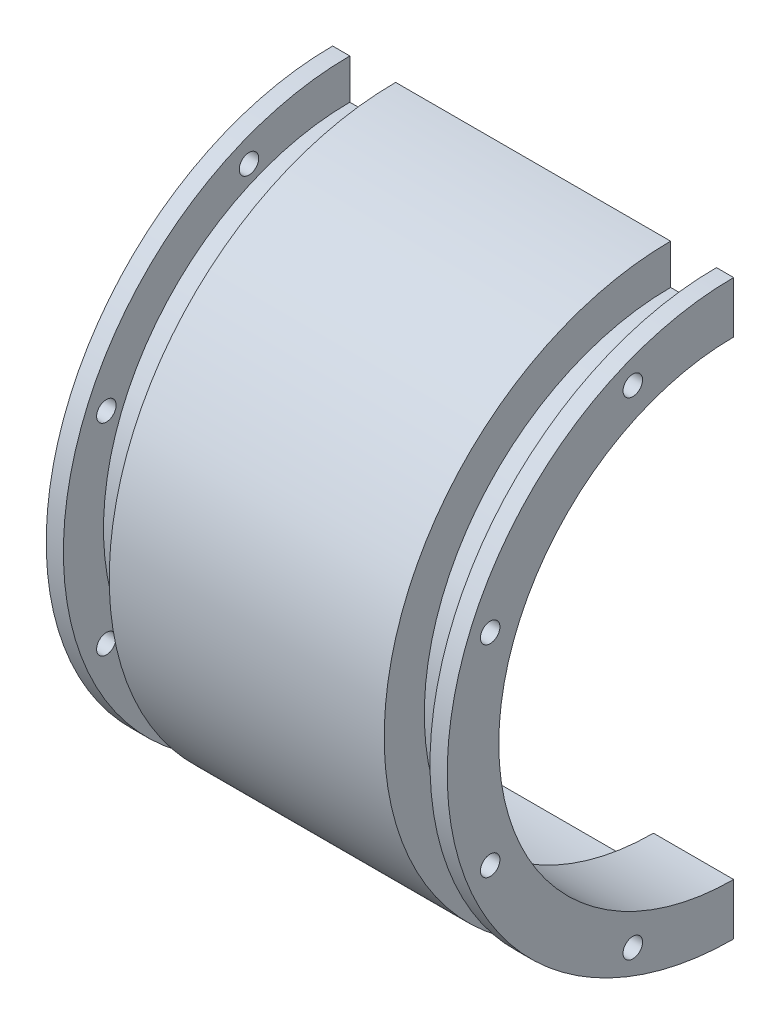
ISO-10303-21;
HEADER;
FILE_DESCRIPTION(('STEP AP214'),'2;1');
FILE_NAME('part.step','',(''),(''),'','','');
FILE_SCHEMA(('AUTOMOTIVE_DESIGN { 1 0 10303 214 1 1 1 1 }'));
ENDSEC;
DATA;
#1=APPLICATION_CONTEXT('core data for automotive mechanical design processes');
#2=APPLICATION_PROTOCOL_DEFINITION('international standard','automotive_design',2000,#1);
#3=PRODUCT_CONTEXT('',#1,'mechanical');
#4=PRODUCT('Part','Part','',(#3));
#5=PRODUCT_RELATED_PRODUCT_CATEGORY('part','',(#4));
#6=PRODUCT_DEFINITION_FORMATION('','',#4);
#7=PRODUCT_DEFINITION_CONTEXT('part definition',#1,'design');
#8=PRODUCT_DEFINITION('design','',#6,#7);
#9=PRODUCT_DEFINITION_SHAPE('','',#8);
#10=(LENGTH_UNIT() NAMED_UNIT(*) SI_UNIT(.MILLI.,.METRE.));
#11=(NAMED_UNIT(*) PLANE_ANGLE_UNIT() SI_UNIT($,.RADIAN.));
#12=(NAMED_UNIT(*) SI_UNIT($,.STERADIAN.) SOLID_ANGLE_UNIT());
#13=UNCERTAINTY_MEASURE_WITH_UNIT(LENGTH_MEASURE(1.E-05),#10,'distance_accuracy_value','');
#14=(GEOMETRIC_REPRESENTATION_CONTEXT(3) GLOBAL_UNCERTAINTY_ASSIGNED_CONTEXT((#13)) GLOBAL_UNIT_ASSIGNED_CONTEXT((#10,
#11,#12)) REPRESENTATION_CONTEXT('',''));
#15=CARTESIAN_POINT('',(0.,0.,0.));
#16=DIRECTION('',(0.,0.,1.));
#17=DIRECTION('',(1.,0.,0.));
#18=AXIS2_PLACEMENT_3D('',#15,#16,#17);
#19=CARTESIAN_POINT('',(35.,-41.,-2.86301469785137E-13));
#20=DIRECTION('',(-1.,0.,0.));
#21=DIRECTION('',(0.,-1.,0.));
#22=AXIS2_PLACEMENT_3D('',#19,#20,#21);
#23=PLANE('',#22);
#24=CARTESIAN_POINT('',(35.,42.4984584955192,17.6034378887942));
#25=DIRECTION('',(1.,0.,0.));
#26=DIRECTION('',(0.,0.,-1.));
#27=AXIS2_PLACEMENT_3D('',#24,#25,#26);
#28=CIRCLE('',#27,1.69999999999999);
#29=CARTESIAN_POINT('',(35.,42.4984584955192,15.9034378887942));
#30=VERTEX_POINT('',#29);
#31=EDGE_CURVE('E678',#30,#30,#28,.T.);
#32=ORIENTED_EDGE('',*,*,#31,.F.);
#33=EDGE_LOOP('',(#32));
#34=FACE_BOUND('',#33,.T.);
#35=CARTESIAN_POINT('',(35.,17.603437888794,42.4984584955192));
#36=DIRECTION('',(1.,0.,0.));
#37=DIRECTION('',(0.,0.,-1.));
#38=AXIS2_PLACEMENT_3D('',#35,#36,#37);
#39=CIRCLE('',#38,1.69999999999999);
#40=CARTESIAN_POINT('',(35.,17.603437888794,40.7984584955192));
#41=VERTEX_POINT('',#40);
#42=EDGE_CURVE('E674',#41,#41,#39,.T.);
#43=ORIENTED_EDGE('',*,*,#42,.F.);
#44=EDGE_LOOP('',(#43));
#45=FACE_BOUND('',#44,.T.);
#46=CARTESIAN_POINT('',(35.,-17.6034378887943,42.4984584955191));
#47=DIRECTION('',(1.,0.,0.));
#48=DIRECTION('',(0.,0.,-1.));
#49=AXIS2_PLACEMENT_3D('',#46,#47,#48);
#50=CIRCLE('',#49,1.69999999999999);
#51=CARTESIAN_POINT('',(35.,-17.6034378887943,40.7984584955191));
#52=VERTEX_POINT('',#51);
#53=EDGE_CURVE('E670',#52,#52,#50,.T.);
#54=ORIENTED_EDGE('',*,*,#53,.F.);
#55=EDGE_LOOP('',(#54));
#56=FACE_BOUND('',#55,.T.);
#57=CARTESIAN_POINT('',(35.,0.,0.));
#58=DIRECTION('',(-1.,0.,0.));
#59=DIRECTION('',(0.,-1.,0.));
#60=AXIS2_PLACEMENT_3D('',#57,#58,#59);
#61=CIRCLE('',#60,50.);
#62=CARTESIAN_POINT('',(35.,-50.,-3.49148133884313E-13));
#63=VERTEX_POINT('',#62);
#64=CARTESIAN_POINT('',(35.,50.,0.));
#65=VERTEX_POINT('',#64);
#66=EDGE_CURVE('E291',#63,#65,#61,.T.);
#67=ORIENTED_EDGE('',*,*,#66,.F.);
#68=DIRECTION('',(0.,-1.,0.));
#69=VECTOR('',#68,1.);
#70=CARTESIAN_POINT('',(35.,-41.,-2.86301469785137E-13));
#71=LINE('',#70,#69);
#72=CARTESIAN_POINT('',(35.,-41.,-2.86301469785137E-13));
#73=VERTEX_POINT('',#72);
#74=EDGE_CURVE('E244',#73,#63,#71,.T.);
#75=ORIENTED_EDGE('',*,*,#74,.F.);
#76=CARTESIAN_POINT('',(35.,0.,0.));
#77=DIRECTION('',(-1.,0.,0.));
#78=DIRECTION('',(0.,-1.,0.));
#79=AXIS2_PLACEMENT_3D('',#76,#77,#78);
#80=CIRCLE('',#79,41.);
#81=CARTESIAN_POINT('',(35.,41.,0.));
#82=VERTEX_POINT('',#81);
#83=EDGE_CURVE('E293',#73,#82,#80,.T.);
#84=ORIENTED_EDGE('',*,*,#83,.T.);
#85=DIRECTION('',(0.,1.,0.));
#86=VECTOR('',#85,1.);
#87=CARTESIAN_POINT('',(35.,41.,0.));
#88=LINE('',#87,#86);
#89=EDGE_CURVE('E202',#82,#65,#88,.T.);
#90=ORIENTED_EDGE('',*,*,#89,.T.);
#91=EDGE_LOOP('',(#67,#75,#84,#90));
#92=FACE_BOUND('',#91,.T.);
#93=CARTESIAN_POINT('',(35.,-42.4984584955193,17.6034378887939));
#94=DIRECTION('',(1.,0.,0.));
#95=DIRECTION('',(0.,0.,-1.));
#96=AXIS2_PLACEMENT_3D('',#93,#94,#95);
#97=CIRCLE('',#96,1.69999999999999);
#98=CARTESIAN_POINT('',(35.,-42.4984584955193,15.9034378887939));
#99=VERTEX_POINT('',#98);
#100=EDGE_CURVE('E626',#99,#99,#97,.T.);
#101=ORIENTED_EDGE('',*,*,#100,.F.);
#102=EDGE_LOOP('',(#101));
#103=FACE_BOUND('',#102,.T.);
#104=ADVANCED_FACE('F39',(#34,#45,#56,#92,#103),#23,.F.);
#105=CARTESIAN_POINT('',(-35.,-50.,-3.49148133884313E-13));
#106=DIRECTION('',(1.,0.,0.));
#107=DIRECTION('',(0.,1.,0.));
#108=AXIS2_PLACEMENT_3D('',#105,#106,#107);
#109=PLANE('',#108);
#110=CARTESIAN_POINT('',(-35.,42.4984584955192,17.6034378887942));
#111=DIRECTION('',(-1.,0.,0.));
#112=DIRECTION('',(0.,0.,1.));
#113=AXIS2_PLACEMENT_3D('',#110,#111,#112);
#114=CIRCLE('',#113,1.69999999999999);
#115=CARTESIAN_POINT('',(-35.,42.4984584955192,19.3034378887942));
#116=VERTEX_POINT('',#115);
#117=EDGE_CURVE('E625',#116,#116,#114,.T.);
#118=ORIENTED_EDGE('',*,*,#117,.F.);
#119=EDGE_LOOP('',(#118));
#120=FACE_BOUND('',#119,.T.);
#121=CARTESIAN_POINT('',(-35.,17.603437888794,42.4984584955192));
#122=DIRECTION('',(-1.,0.,0.));
#123=DIRECTION('',(0.,0.,1.));
#124=AXIS2_PLACEMENT_3D('',#121,#122,#123);
#125=CIRCLE('',#124,1.69999999999999);
#126=CARTESIAN_POINT('',(-35.,17.603437888794,44.1984584955192));
#127=VERTEX_POINT('',#126);
#128=EDGE_CURVE('E637',#127,#127,#125,.T.);
#129=ORIENTED_EDGE('',*,*,#128,.F.);
#130=EDGE_LOOP('',(#129));
#131=FACE_BOUND('',#130,.T.);
#132=CARTESIAN_POINT('',(-35.,-42.4984584955193,17.6034378887939));
#133=DIRECTION('',(-1.,0.,0.));
#134=DIRECTION('',(0.,0.,1.));
#135=AXIS2_PLACEMENT_3D('',#132,#133,#134);
#136=CIRCLE('',#135,1.69999999999999);
#137=CARTESIAN_POINT('',(-35.,-42.4984584955193,19.3034378887939));
#138=VERTEX_POINT('',#137);
#139=EDGE_CURVE('E649',#138,#138,#136,.T.);
#140=ORIENTED_EDGE('',*,*,#139,.F.);
#141=EDGE_LOOP('',(#140));
#142=FACE_BOUND('',#141,.T.);
#143=CARTESIAN_POINT('',(-35.,0.,0.));
#144=DIRECTION('',(-1.,0.,0.));
#145=DIRECTION('',(0.,-1.,0.));
#146=AXIS2_PLACEMENT_3D('',#143,#144,#145);
#147=CIRCLE('',#146,41.);
#148=CARTESIAN_POINT('',(-35.,-41.,-2.86301469785137E-13));
#149=VERTEX_POINT('',#148);
#150=CARTESIAN_POINT('',(-35.,41.,0.));
#151=VERTEX_POINT('',#150);
#152=EDGE_CURVE('E163',#149,#151,#147,.T.);
#153=ORIENTED_EDGE('',*,*,#152,.F.);
#154=DIRECTION('',(0.,1.,0.));
#155=VECTOR('',#154,1.);
#156=CARTESIAN_POINT('',(-35.,-50.,-3.49148133884313E-13));
#157=LINE('',#156,#155);
#158=CARTESIAN_POINT('',(-35.,-50.,-3.49148133884313E-13));
#159=VERTEX_POINT('',#158);
#160=EDGE_CURVE('E231',#159,#149,#157,.T.);
#161=ORIENTED_EDGE('',*,*,#160,.F.);
#162=CARTESIAN_POINT('',(-35.,0.,0.));
#163=DIRECTION('',(-1.,0.,0.));
#164=DIRECTION('',(0.,-1.,0.));
#165=AXIS2_PLACEMENT_3D('',#162,#163,#164);
#166=CIRCLE('',#165,50.);
#167=CARTESIAN_POINT('',(-35.,50.,0.));
#168=VERTEX_POINT('',#167);
#169=EDGE_CURVE('E181',#159,#168,#166,.T.);
#170=ORIENTED_EDGE('',*,*,#169,.T.);
#171=DIRECTION('',(0.,-1.,0.));
#172=VECTOR('',#171,1.);
#173=CARTESIAN_POINT('',(-35.,50.,0.));
#174=LINE('',#173,#172);
#175=EDGE_CURVE('E178',#168,#151,#174,.T.);
#176=ORIENTED_EDGE('',*,*,#175,.T.);
#177=EDGE_LOOP('',(#153,#161,#170,#176));
#178=FACE_BOUND('',#177,.T.);
#179=CARTESIAN_POINT('',(-35.,-17.6034378887943,42.4984584955191));
#180=DIRECTION('',(-1.,0.,0.));
#181=DIRECTION('',(0.,0.,1.));
#182=AXIS2_PLACEMENT_3D('',#179,#180,#181);
#183=CIRCLE('',#182,1.69999999999999);
#184=CARTESIAN_POINT('',(-35.,-17.6034378887943,44.1984584955191));
#185=VERTEX_POINT('',#184);
#186=EDGE_CURVE('E643',#185,#185,#183,.T.);
#187=ORIENTED_EDGE('',*,*,#186,.F.);
#188=EDGE_LOOP('',(#187));
#189=FACE_BOUND('',#188,.T.);
#190=ADVANCED_FACE('F179',(#120,#131,#142,#178,#189),#109,.F.);
#191=CARTESIAN_POINT('',(-50.,0.,0.));
#192=DIRECTION('',(-1.,0.,0.));
#193=DIRECTION('',(0.,-1.,0.));
#194=AXIS2_PLACEMENT_3D('',#191,#192,#193);
#195=CYLINDRICAL_SURFACE('',#194,41.);
#196=CARTESIAN_POINT('',(-21.,0.,0.));
#197=DIRECTION('',(-1.,0.,0.));
#198=DIRECTION('',(0.,-1.,0.));
#199=AXIS2_PLACEMENT_3D('',#196,#197,#198);
#200=CIRCLE('',#199,41.);
#201=CARTESIAN_POINT('',(-21.,-41.,-2.86301469785137E-13));
#202=VERTEX_POINT('',#201);
#203=CARTESIAN_POINT('',(-21.,41.,0.));
#204=VERTEX_POINT('',#203);
#205=EDGE_CURVE('E175',#202,#204,#200,.T.);
#206=ORIENTED_EDGE('',*,*,#205,.F.);
#207=DIRECTION('',(1.,0.,0.));
#208=VECTOR('',#207,1.);
#209=CARTESIAN_POINT('',(-35.,-41.,-2.86301469785137E-13));
#210=LINE('',#209,#208);
#211=EDGE_CURVE('E170',#149,#202,#210,.T.);
#212=ORIENTED_EDGE('',*,*,#211,.F.);
#213=ORIENTED_EDGE('',*,*,#152,.T.);
#214=DIRECTION('',(1.,0.,0.));
#215=VECTOR('',#214,1.);
#216=CARTESIAN_POINT('',(-35.,41.,0.));
#217=LINE('',#216,#215);
#218=EDGE_CURVE('E167',#151,#204,#217,.T.);
#219=ORIENTED_EDGE('',*,*,#218,.T.);
#220=EDGE_LOOP('',(#206,#212,#213,#219));
#221=FACE_BOUND('',#220,.T.);
#222=ADVANCED_FACE('F165',(#221),#195,.F.);
#223=CARTESIAN_POINT('',(-21.,-41.,-2.86301469785137E-13));
#224=DIRECTION('',(-1.,0.,0.));
#225=DIRECTION('',(0.,-1.,0.));
#226=AXIS2_PLACEMENT_3D('',#223,#224,#225);
#227=PLANE('',#226);
#228=DIRECTION('',(0.,1.,0.));
#229=VECTOR('',#228,1.);
#230=CARTESIAN_POINT('',(-21.,41.,0.));
#231=LINE('',#230,#229);
#232=CARTESIAN_POINT('',(-21.,42.,0.));
#233=VERTEX_POINT('',#232);
#234=EDGE_CURVE('E189',#204,#233,#231,.T.);
#235=ORIENTED_EDGE('',*,*,#234,.T.);
#236=CARTESIAN_POINT('',(-21.,0.,0.));
#237=DIRECTION('',(-1.,0.,0.));
#238=DIRECTION('',(0.,-1.,0.));
#239=AXIS2_PLACEMENT_3D('',#236,#237,#238);
#240=CIRCLE('',#239,42.);
#241=CARTESIAN_POINT('',(-21.,-42.,-2.93284432462823E-13));
#242=VERTEX_POINT('',#241);
#243=EDGE_CURVE('E303',#233,#242,#240,.F.);
#244=ORIENTED_EDGE('',*,*,#243,.T.);
#245=DIRECTION('',(0.,-1.,0.));
#246=VECTOR('',#245,1.);
#247=CARTESIAN_POINT('',(-21.,-41.,-2.86301469785137E-13));
#248=LINE('',#247,#246);
#249=EDGE_CURVE('E234',#202,#242,#248,.T.);
#250=ORIENTED_EDGE('',*,*,#249,.F.);
#251=ORIENTED_EDGE('',*,*,#205,.T.);
#252=EDGE_LOOP('',(#235,#244,#250,#251));
#253=FACE_BOUND('',#252,.T.);
#254=ADVANCED_FACE('F365',(#253),#227,.F.);
#255=CARTESIAN_POINT('',(-50.,0.,0.));
#256=DIRECTION('',(-1.,0.,0.));
#257=DIRECTION('',(0.,-1.,0.));
#258=AXIS2_PLACEMENT_3D('',#255,#256,#257);
#259=CYLINDRICAL_SURFACE('',#258,47.);
#260=DIRECTION('',(1.,0.,0.));
#261=VECTOR('',#260,1.);
#262=CARTESIAN_POINT('',(-21.,-47.,-3.28199245851255E-13));
#263=LINE('',#262,#261);
#264=CARTESIAN_POINT('',(-16.,-47.,-3.28199245851255E-13));
#265=VERTEX_POINT('',#264);
#266=CARTESIAN_POINT('',(16.,-47.,-3.28199245851254E-13));
#267=VERTEX_POINT('',#266);
#268=EDGE_CURVE('E237',#265,#267,#263,.T.);
#269=ORIENTED_EDGE('',*,*,#268,.F.);
#270=CARTESIAN_POINT('',(-16.,0.,0.));
#271=DIRECTION('',(-1.,0.,0.));
#272=DIRECTION('',(0.,-1.,0.));
#273=AXIS2_PLACEMENT_3D('',#270,#271,#272);
#274=CIRCLE('',#273,47.);
#275=CARTESIAN_POINT('',(-16.,47.,0.));
#276=VERTEX_POINT('',#275);
#277=EDGE_CURVE('E300',#265,#276,#274,.T.);
#278=ORIENTED_EDGE('',*,*,#277,.T.);
#279=DIRECTION('',(1.,0.,0.));
#280=VECTOR('',#279,1.);
#281=CARTESIAN_POINT('',(-21.,47.,0.));
#282=LINE('',#281,#280);
#283=CARTESIAN_POINT('',(16.,47.,0.));
#284=VERTEX_POINT('',#283);
#285=EDGE_CURVE('E191',#276,#284,#282,.T.);
#286=ORIENTED_EDGE('',*,*,#285,.T.);
#287=CARTESIAN_POINT('',(16.,0.,0.));
#288=DIRECTION('',(1.,0.,0.));
#289=DIRECTION('',(0.,1.,0.));
#290=AXIS2_PLACEMENT_3D('',#287,#288,#289);
#291=CIRCLE('',#290,47.);
#292=EDGE_CURVE('E174',#284,#267,#291,.T.);
#293=ORIENTED_EDGE('',*,*,#292,.T.);
#294=EDGE_LOOP('',(#269,#278,#286,#293));
#295=FACE_BOUND('',#294,.T.);
#296=ADVANCED_FACE('F315',(#295),#259,.F.);
#297=CARTESIAN_POINT('',(21.,-47.,-3.28199245851254E-13));
#298=DIRECTION('',(1.,0.,0.));
#299=DIRECTION('',(0.,1.,0.));
#300=AXIS2_PLACEMENT_3D('',#297,#298,#299);
#301=PLANE('',#300);
#302=DIRECTION('',(0.,1.,0.));
#303=VECTOR('',#302,1.);
#304=CARTESIAN_POINT('',(21.,-47.,-3.28199245851254E-13));
#305=LINE('',#304,#303);
#306=CARTESIAN_POINT('',(21.,-42.,-2.93284432462823E-13));
#307=VERTEX_POINT('',#306);
#308=CARTESIAN_POINT('',(21.,-41.,-2.86301469785137E-13));
#309=VERTEX_POINT('',#308);
#310=EDGE_CURVE('E239',#307,#309,#305,.T.);
#311=ORIENTED_EDGE('',*,*,#310,.F.);
#312=CARTESIAN_POINT('',(21.,0.,0.));
#313=DIRECTION('',(1.,0.,0.));
#314=DIRECTION('',(0.,1.,0.));
#315=AXIS2_PLACEMENT_3D('',#312,#313,#314);
#316=CIRCLE('',#315,42.);
#317=CARTESIAN_POINT('',(21.,42.,0.));
#318=VERTEX_POINT('',#317);
#319=EDGE_CURVE('E305',#307,#318,#316,.F.);
#320=ORIENTED_EDGE('',*,*,#319,.T.);
#321=DIRECTION('',(0.,-1.,0.));
#322=VECTOR('',#321,1.);
#323=CARTESIAN_POINT('',(21.,47.,0.));
#324=LINE('',#323,#322);
#325=CARTESIAN_POINT('',(21.,41.,0.));
#326=VERTEX_POINT('',#325);
#327=EDGE_CURVE('E197',#318,#326,#324,.T.);
#328=ORIENTED_EDGE('',*,*,#327,.T.);
#329=CARTESIAN_POINT('',(21.,0.,0.));
#330=DIRECTION('',(-1.,0.,0.));
#331=DIRECTION('',(0.,-1.,0.));
#332=AXIS2_PLACEMENT_3D('',#329,#330,#331);
#333=CIRCLE('',#332,41.);
#334=EDGE_CURVE('E295',#309,#326,#333,.T.);
#335=ORIENTED_EDGE('',*,*,#334,.F.);
#336=EDGE_LOOP('',(#311,#320,#328,#335));
#337=FACE_BOUND('',#336,.T.);
#338=ADVANCED_FACE('F318',(#337),#301,.F.);
#339=CARTESIAN_POINT('',(-50.,0.,0.));
#340=DIRECTION('',(-1.,0.,0.));
#341=DIRECTION('',(0.,-1.,0.));
#342=AXIS2_PLACEMENT_3D('',#339,#340,#341);
#343=CYLINDRICAL_SURFACE('',#342,41.);
#344=ORIENTED_EDGE('',*,*,#83,.F.);
#345=DIRECTION('',(1.,0.,0.));
#346=VECTOR('',#345,1.);
#347=CARTESIAN_POINT('',(21.,-41.,-2.86301469785137E-13));
#348=LINE('',#347,#346);
#349=EDGE_CURVE('E241',#309,#73,#348,.T.);
#350=ORIENTED_EDGE('',*,*,#349,.F.);
#351=ORIENTED_EDGE('',*,*,#334,.T.);
#352=DIRECTION('',(1.,0.,0.));
#353=VECTOR('',#352,1.);
#354=CARTESIAN_POINT('',(21.,41.,0.));
#355=LINE('',#354,#353);
#356=EDGE_CURVE('E199',#326,#82,#355,.T.);
#357=ORIENTED_EDGE('',*,*,#356,.T.);
#358=EDGE_LOOP('',(#344,#350,#351,#357));
#359=FACE_BOUND('',#358,.T.);
#360=ADVANCED_FACE('F395',(#359),#343,.F.);
#361=CARTESIAN_POINT('',(-50.,0.,0.));
#362=DIRECTION('',(-1.,0.,0.));
#363=DIRECTION('',(0.,-1.,0.));
#364=AXIS2_PLACEMENT_3D('',#361,#362,#363);
#365=CYLINDRICAL_SURFACE('',#364,50.);
#366=CARTESIAN_POINT('',(32.,0.,0.));
#367=DIRECTION('',(-1.,0.,0.));
#368=DIRECTION('',(0.,-1.,0.));
#369=AXIS2_PLACEMENT_3D('',#366,#367,#368);
#370=CIRCLE('',#369,50.);
#371=CARTESIAN_POINT('',(32.,-50.,-3.49148133884313E-13));
#372=VERTEX_POINT('',#371);
#373=CARTESIAN_POINT('',(32.,50.,0.));
#374=VERTEX_POINT('',#373);
#375=EDGE_CURVE('E289',#372,#374,#370,.T.);
#376=ORIENTED_EDGE('',*,*,#375,.F.);
#377=DIRECTION('',(-1.,0.,0.));
#378=VECTOR('',#377,1.);
#379=CARTESIAN_POINT('',(35.,-50.,-3.49148133884313E-13));
#380=LINE('',#379,#378);
#381=EDGE_CURVE('E247',#63,#372,#380,.T.);
#382=ORIENTED_EDGE('',*,*,#381,.F.);
#383=ORIENTED_EDGE('',*,*,#66,.T.);
#384=DIRECTION('',(-1.,0.,0.));
#385=VECTOR('',#384,1.);
#386=CARTESIAN_POINT('',(35.,50.,0.));
#387=LINE('',#386,#385);
#388=EDGE_CURVE('E205',#65,#374,#387,.T.);
#389=ORIENTED_EDGE('',*,*,#388,.T.);
#390=EDGE_LOOP('',(#376,#382,#383,#389));
#391=FACE_BOUND('',#390,.T.);
#392=ADVANCED_FACE('F330',(#391),#365,.T.);
#393=CARTESIAN_POINT('',(32.,-50.,-3.49148133884313E-13));
#394=DIRECTION('',(1.,0.,0.));
#395=DIRECTION('',(0.,1.,0.));
#396=AXIS2_PLACEMENT_3D('',#393,#394,#395);
#397=PLANE('',#396);
#398=CARTESIAN_POINT('',(32.,42.4984584955192,17.6034378887942));
#399=DIRECTION('',(1.,0.,0.));
#400=DIRECTION('',(0.,1.,0.));
#401=AXIS2_PLACEMENT_3D('',#398,#399,#400);
#402=CIRCLE('',#401,1.69999999999999);
#403=CARTESIAN_POINT('',(32.,44.1984584955192,17.6034378887942));
#404=VERTEX_POINT('',#403);
#405=EDGE_CURVE('E613',#404,#404,#402,.T.);
#406=ORIENTED_EDGE('',*,*,#405,.T.);
#407=EDGE_LOOP('',(#406));
#408=FACE_BOUND('',#407,.T.);
#409=CARTESIAN_POINT('',(32.,17.603437888794,42.4984584955192));
#410=DIRECTION('',(1.,0.,0.));
#411=DIRECTION('',(0.,1.,0.));
#412=AXIS2_PLACEMENT_3D('',#409,#410,#411);
#413=CIRCLE('',#412,1.69999999999999);
#414=CARTESIAN_POINT('',(32.,19.303437888794,42.4984584955192));
#415=VERTEX_POINT('',#414);
#416=EDGE_CURVE('E617',#415,#415,#413,.T.);
#417=ORIENTED_EDGE('',*,*,#416,.T.);
#418=EDGE_LOOP('',(#417));
#419=FACE_BOUND('',#418,.T.);
#420=CARTESIAN_POINT('',(32.,-17.6034378887943,42.4984584955191));
#421=DIRECTION('',(1.,0.,0.));
#422=DIRECTION('',(0.,1.,0.));
#423=AXIS2_PLACEMENT_3D('',#420,#421,#422);
#424=CIRCLE('',#423,1.69999999999999);
#425=CARTESIAN_POINT('',(32.,-15.9034378887943,42.4984584955191));
#426=VERTEX_POINT('',#425);
#427=EDGE_CURVE('E621',#426,#426,#424,.T.);
#428=ORIENTED_EDGE('',*,*,#427,.T.);
#429=EDGE_LOOP('',(#428));
#430=FACE_BOUND('',#429,.T.);
#431=CARTESIAN_POINT('',(32.,-42.4984584955193,17.6034378887939));
#432=DIRECTION('',(1.,0.,0.));
#433=DIRECTION('',(0.,1.,0.));
#434=AXIS2_PLACEMENT_3D('',#431,#432,#433);
#435=CIRCLE('',#434,1.69999999999999);
#436=CARTESIAN_POINT('',(32.,-40.7984584955193,17.6034378887939));
#437=VERTEX_POINT('',#436);
#438=EDGE_CURVE('E624',#437,#437,#435,.T.);
#439=ORIENTED_EDGE('',*,*,#438,.T.);
#440=EDGE_LOOP('',(#439));
#441=FACE_BOUND('',#440,.T.);
#442=CARTESIAN_POINT('',(32.,0.,0.));
#443=DIRECTION('',(-1.,0.,0.));
#444=DIRECTION('',(0.,-1.,0.));
#445=AXIS2_PLACEMENT_3D('',#442,#443,#444);
#446=CIRCLE('',#445,43.);
#447=CARTESIAN_POINT('',(32.,-43.,-3.00267395140509E-13));
#448=VERTEX_POINT('',#447);
#449=CARTESIAN_POINT('',(32.,43.,0.));
#450=VERTEX_POINT('',#449);
#451=EDGE_CURVE('E287',#448,#450,#446,.T.);
#452=ORIENTED_EDGE('',*,*,#451,.F.);
#453=DIRECTION('',(0.,1.,0.));
#454=VECTOR('',#453,1.);
#455=CARTESIAN_POINT('',(32.,-50.,-3.49148133884313E-13));
#456=LINE('',#455,#454);
#457=EDGE_CURVE('E250',#372,#448,#456,.T.);
#458=ORIENTED_EDGE('',*,*,#457,.F.);
#459=ORIENTED_EDGE('',*,*,#375,.T.);
#460=DIRECTION('',(0.,-1.,0.));
#461=VECTOR('',#460,1.);
#462=CARTESIAN_POINT('',(32.,50.,0.));
#463=LINE('',#462,#461);
#464=EDGE_CURVE('E208',#374,#450,#463,.T.);
#465=ORIENTED_EDGE('',*,*,#464,.T.);
#466=EDGE_LOOP('',(#452,#458,#459,#465));
#467=FACE_BOUND('',#466,.T.);
#468=ADVANCED_FACE('F335',(#408,#419,#430,#441,#467),#397,.F.);
#469=CARTESIAN_POINT('',(-50.,0.,0.));
#470=DIRECTION('',(-1.,0.,0.));
#471=DIRECTION('',(0.,-1.,0.));
#472=AXIS2_PLACEMENT_3D('',#469,#470,#471);
#473=CYLINDRICAL_SURFACE('',#472,43.);
#474=CARTESIAN_POINT('',(24.,0.,0.));
#475=DIRECTION('',(-1.,0.,0.));
#476=DIRECTION('',(0.,-1.,0.));
#477=AXIS2_PLACEMENT_3D('',#474,#475,#476);
#478=CIRCLE('',#477,43.);
#479=CARTESIAN_POINT('',(24.,-43.,-3.00267395140509E-13));
#480=VERTEX_POINT('',#479);
#481=CARTESIAN_POINT('',(24.,43.,0.));
#482=VERTEX_POINT('',#481);
#483=EDGE_CURVE('E285',#480,#482,#478,.T.);
#484=ORIENTED_EDGE('',*,*,#483,.F.);
#485=DIRECTION('',(-1.,0.,0.));
#486=VECTOR('',#485,1.);
#487=CARTESIAN_POINT('',(32.,-43.,-3.00267395140509E-13));
#488=LINE('',#487,#486);
#489=EDGE_CURVE('E253',#448,#480,#488,.T.);
#490=ORIENTED_EDGE('',*,*,#489,.F.);
#491=ORIENTED_EDGE('',*,*,#451,.T.);
#492=DIRECTION('',(-1.,0.,0.));
#493=VECTOR('',#492,1.);
#494=CARTESIAN_POINT('',(32.,43.,0.));
#495=LINE('',#494,#493);
#496=EDGE_CURVE('E211',#450,#482,#495,.T.);
#497=ORIENTED_EDGE('',*,*,#496,.T.);
#498=EDGE_LOOP('',(#484,#490,#491,#497));
#499=FACE_BOUND('',#498,.T.);
#500=ADVANCED_FACE('F338',(#499),#473,.T.);
#501=CARTESIAN_POINT('',(24.,-43.,-3.00267395140509E-13));
#502=DIRECTION('',(-1.,0.,0.));
#503=DIRECTION('',(0.,-1.,0.));
#504=AXIS2_PLACEMENT_3D('',#501,#502,#503);
#505=PLANE('',#504);
#506=CARTESIAN_POINT('',(24.,0.,0.));
#507=DIRECTION('',(-1.,0.,0.));
#508=DIRECTION('',(0.,-1.,0.));
#509=AXIS2_PLACEMENT_3D('',#506,#507,#508);
#510=CIRCLE('',#509,50.);
#511=CARTESIAN_POINT('',(24.,-50.,-3.49148133884313E-13));
#512=VERTEX_POINT('',#511);
#513=CARTESIAN_POINT('',(24.,50.,0.));
#514=VERTEX_POINT('',#513);
#515=EDGE_CURVE('E283',#512,#514,#510,.T.);
#516=ORIENTED_EDGE('',*,*,#515,.F.);
#517=DIRECTION('',(0.,-1.,0.));
#518=VECTOR('',#517,1.);
#519=CARTESIAN_POINT('',(24.,-43.,-3.00267395140509E-13));
#520=LINE('',#519,#518);
#521=EDGE_CURVE('E256',#480,#512,#520,.T.);
#522=ORIENTED_EDGE('',*,*,#521,.F.);
#523=ORIENTED_EDGE('',*,*,#483,.T.);
#524=DIRECTION('',(0.,1.,0.));
#525=VECTOR('',#524,1.);
#526=CARTESIAN_POINT('',(24.,43.,0.));
#527=LINE('',#526,#525);
#528=EDGE_CURVE('E214',#482,#514,#527,.T.);
#529=ORIENTED_EDGE('',*,*,#528,.T.);
#530=EDGE_LOOP('',(#516,#522,#523,#529));
#531=FACE_BOUND('',#530,.T.);
#532=ADVANCED_FACE('F343',(#531),#505,.F.);
#533=CARTESIAN_POINT('',(-50.,0.,0.));
#534=DIRECTION('',(-1.,0.,0.));
#535=DIRECTION('',(0.,-1.,0.));
#536=AXIS2_PLACEMENT_3D('',#533,#534,#535);
#537=CYLINDRICAL_SURFACE('',#536,50.);
#538=CARTESIAN_POINT('',(-24.,0.,0.));
#539=DIRECTION('',(-1.,0.,0.));
#540=DIRECTION('',(0.,-1.,0.));
#541=AXIS2_PLACEMENT_3D('',#538,#539,#540);
#542=CIRCLE('',#541,50.);
#543=CARTESIAN_POINT('',(-24.,-50.,-3.49148133884313E-13));
#544=VERTEX_POINT('',#543);
#545=CARTESIAN_POINT('',(-24.,50.,0.));
#546=VERTEX_POINT('',#545);
#547=EDGE_CURVE('E281',#544,#546,#542,.T.);
#548=ORIENTED_EDGE('',*,*,#547,.F.);
#549=DIRECTION('',(-1.,0.,0.));
#550=VECTOR('',#549,1.);
#551=CARTESIAN_POINT('',(24.,-50.,-3.49148133884313E-13));
#552=LINE('',#551,#550);
#553=EDGE_CURVE('E259',#512,#544,#552,.T.);
#554=ORIENTED_EDGE('',*,*,#553,.F.);
#555=ORIENTED_EDGE('',*,*,#515,.T.);
#556=DIRECTION('',(-1.,0.,0.));
#557=VECTOR('',#556,1.);
#558=CARTESIAN_POINT('',(24.,50.,0.));
#559=LINE('',#558,#557);
#560=EDGE_CURVE('E217',#514,#546,#559,.T.);
#561=ORIENTED_EDGE('',*,*,#560,.T.);
#562=EDGE_LOOP('',(#548,#554,#555,#561));
#563=FACE_BOUND('',#562,.T.);
#564=ADVANCED_FACE('F346',(#563),#537,.T.);
#565=CARTESIAN_POINT('',(-24.,-50.,-3.49148133884313E-13));
#566=DIRECTION('',(1.,0.,0.));
#567=DIRECTION('',(0.,1.,0.));
#568=AXIS2_PLACEMENT_3D('',#565,#566,#567);
#569=PLANE('',#568);
#570=CARTESIAN_POINT('',(-24.,0.,0.));
#571=DIRECTION('',(-1.,0.,0.));
#572=DIRECTION('',(0.,-1.,0.));
#573=AXIS2_PLACEMENT_3D('',#570,#571,#572);
#574=CIRCLE('',#573,43.);
#575=CARTESIAN_POINT('',(-24.,-43.,-3.0026739514051E-13));
#576=VERTEX_POINT('',#575);
#577=CARTESIAN_POINT('',(-24.,43.,0.));
#578=VERTEX_POINT('',#577);
#579=EDGE_CURVE('E279',#576,#578,#574,.T.);
#580=ORIENTED_EDGE('',*,*,#579,.F.);
#581=DIRECTION('',(0.,1.,0.));
#582=VECTOR('',#581,1.);
#583=CARTESIAN_POINT('',(-24.,-50.,-3.49148133884313E-13));
#584=LINE('',#583,#582);
#585=EDGE_CURVE('E262',#544,#576,#584,.T.);
#586=ORIENTED_EDGE('',*,*,#585,.F.);
#587=ORIENTED_EDGE('',*,*,#547,.T.);
#588=DIRECTION('',(0.,-1.,0.));
#589=VECTOR('',#588,1.);
#590=CARTESIAN_POINT('',(-24.,50.,0.));
#591=LINE('',#590,#589);
#592=EDGE_CURVE('E220',#546,#578,#591,.T.);
#593=ORIENTED_EDGE('',*,*,#592,.T.);
#594=EDGE_LOOP('',(#580,#586,#587,#593));
#595=FACE_BOUND('',#594,.T.);
#596=ADVANCED_FACE('F351',(#595),#569,.F.);
#597=CARTESIAN_POINT('',(-50.,0.,0.));
#598=DIRECTION('',(-1.,0.,0.));
#599=DIRECTION('',(0.,-1.,0.));
#600=AXIS2_PLACEMENT_3D('',#597,#598,#599);
#601=CYLINDRICAL_SURFACE('',#600,43.);
#602=CARTESIAN_POINT('',(-32.,0.,0.));
#603=DIRECTION('',(-1.,0.,0.));
#604=DIRECTION('',(0.,-1.,0.));
#605=AXIS2_PLACEMENT_3D('',#602,#603,#604);
#606=CIRCLE('',#605,43.);
#607=CARTESIAN_POINT('',(-32.,-43.,-3.00267395140509E-13));
#608=VERTEX_POINT('',#607);
#609=CARTESIAN_POINT('',(-32.,43.,0.));
#610=VERTEX_POINT('',#609);
#611=EDGE_CURVE('E277',#608,#610,#606,.T.);
#612=ORIENTED_EDGE('',*,*,#611,.F.);
#613=DIRECTION('',(-1.,0.,0.));
#614=VECTOR('',#613,1.);
#615=CARTESIAN_POINT('',(-24.,-43.,-3.0026739514051E-13));
#616=LINE('',#615,#614);
#617=EDGE_CURVE('E265',#576,#608,#616,.T.);
#618=ORIENTED_EDGE('',*,*,#617,.F.);
#619=ORIENTED_EDGE('',*,*,#579,.T.);
#620=DIRECTION('',(-1.,0.,0.));
#621=VECTOR('',#620,1.);
#622=CARTESIAN_POINT('',(-24.,43.,0.));
#623=LINE('',#622,#621);
#624=EDGE_CURVE('E223',#578,#610,#623,.T.);
#625=ORIENTED_EDGE('',*,*,#624,.T.);
#626=EDGE_LOOP('',(#612,#618,#619,#625));
#627=FACE_BOUND('',#626,.T.);
#628=ADVANCED_FACE('F354',(#627),#601,.T.);
#629=CARTESIAN_POINT('',(-32.,-43.,-3.00267395140509E-13));
#630=DIRECTION('',(-1.,0.,0.));
#631=DIRECTION('',(0.,-1.,0.));
#632=AXIS2_PLACEMENT_3D('',#629,#630,#631);
#633=PLANE('',#632);
#634=CARTESIAN_POINT('',(-32.,42.4984584955192,17.6034378887942));
#635=DIRECTION('',(-1.,0.,0.));
#636=DIRECTION('',(0.,-1.,0.));
#637=AXIS2_PLACEMENT_3D('',#634,#635,#636);
#638=CIRCLE('',#637,1.69999999999999);
#639=CARTESIAN_POINT('',(-32.,40.7984584955192,17.6034378887942));
#640=VERTEX_POINT('',#639);
#641=EDGE_CURVE('E629',#640,#640,#638,.T.);
#642=ORIENTED_EDGE('',*,*,#641,.T.);
#643=EDGE_LOOP('',(#642));
#644=FACE_BOUND('',#643,.T.);
#645=CARTESIAN_POINT('',(-32.,17.603437888794,42.4984584955192));
#646=DIRECTION('',(-1.,0.,0.));
#647=DIRECTION('',(0.,-1.,0.));
#648=AXIS2_PLACEMENT_3D('',#645,#646,#647);
#649=CIRCLE('',#648,1.69999999999999);
#650=CARTESIAN_POINT('',(-32.,15.903437888794,42.4984584955192));
#651=VERTEX_POINT('',#650);
#652=EDGE_CURVE('E640',#651,#651,#649,.T.);
#653=ORIENTED_EDGE('',*,*,#652,.T.);
#654=EDGE_LOOP('',(#653));
#655=FACE_BOUND('',#654,.T.);
#656=CARTESIAN_POINT('',(-32.,-17.6034378887943,42.4984584955191));
#657=DIRECTION('',(-1.,0.,0.));
#658=DIRECTION('',(0.,-1.,0.));
#659=AXIS2_PLACEMENT_3D('',#656,#657,#658);
#660=CIRCLE('',#659,1.69999999999999);
#661=CARTESIAN_POINT('',(-32.,-19.3034378887943,42.4984584955191));
#662=VERTEX_POINT('',#661);
#663=EDGE_CURVE('E646',#662,#662,#660,.T.);
#664=ORIENTED_EDGE('',*,*,#663,.T.);
#665=EDGE_LOOP('',(#664));
#666=FACE_BOUND('',#665,.T.);
#667=CARTESIAN_POINT('',(-32.,-42.4984584955193,17.6034378887939));
#668=DIRECTION('',(-1.,0.,0.));
#669=DIRECTION('',(0.,-1.,0.));
#670=AXIS2_PLACEMENT_3D('',#667,#668,#669);
#671=CIRCLE('',#670,1.69999999999999);
#672=CARTESIAN_POINT('',(-32.,-44.1984584955193,17.6034378887939));
#673=VERTEX_POINT('',#672);
#674=EDGE_CURVE('E185',#673,#673,#671,.T.);
#675=ORIENTED_EDGE('',*,*,#674,.T.);
#676=EDGE_LOOP('',(#675));
#677=FACE_BOUND('',#676,.T.);
#678=CARTESIAN_POINT('',(-32.,0.,0.));
#679=DIRECTION('',(-1.,0.,0.));
#680=DIRECTION('',(0.,-1.,0.));
#681=AXIS2_PLACEMENT_3D('',#678,#679,#680);
#682=CIRCLE('',#681,50.);
#683=CARTESIAN_POINT('',(-32.,-50.,-3.49148133884313E-13));
#684=VERTEX_POINT('',#683);
#685=CARTESIAN_POINT('',(-32.,50.,0.));
#686=VERTEX_POINT('',#685);
#687=EDGE_CURVE('E275',#684,#686,#682,.T.);
#688=ORIENTED_EDGE('',*,*,#687,.F.);
#689=DIRECTION('',(0.,-1.,0.));
#690=VECTOR('',#689,1.);
#691=CARTESIAN_POINT('',(-32.,-43.,-3.00267395140509E-13));
#692=LINE('',#691,#690);
#693=EDGE_CURVE('E268',#608,#684,#692,.T.);
#694=ORIENTED_EDGE('',*,*,#693,.F.);
#695=ORIENTED_EDGE('',*,*,#611,.T.);
#696=DIRECTION('',(0.,1.,0.));
#697=VECTOR('',#696,1.);
#698=CARTESIAN_POINT('',(-32.,43.,0.));
#699=LINE('',#698,#697);
#700=EDGE_CURVE('E226',#610,#686,#699,.T.);
#701=ORIENTED_EDGE('',*,*,#700,.T.);
#702=EDGE_LOOP('',(#688,#694,#695,#701));
#703=FACE_BOUND('',#702,.T.);
#704=ADVANCED_FACE('F359',(#644,#655,#666,#677,#703),#633,.F.);
#705=CARTESIAN_POINT('',(-50.,0.,0.));
#706=DIRECTION('',(-1.,0.,0.));
#707=DIRECTION('',(0.,-1.,0.));
#708=AXIS2_PLACEMENT_3D('',#705,#706,#707);
#709=CYLINDRICAL_SURFACE('',#708,50.);
#710=DIRECTION('',(-1.,0.,0.));
#711=VECTOR('',#710,1.);
#712=CARTESIAN_POINT('',(-32.,-50.,-3.49148133884313E-13));
#713=LINE('',#712,#711);
#714=EDGE_CURVE('E271',#684,#159,#713,.T.);
#715=ORIENTED_EDGE('',*,*,#714,.F.);
#716=ORIENTED_EDGE('',*,*,#687,.T.);
#717=DIRECTION('',(-1.,0.,0.));
#718=VECTOR('',#717,1.);
#719=CARTESIAN_POINT('',(-32.,50.,0.));
#720=LINE('',#719,#718);
#721=EDGE_CURVE('E229',#686,#168,#720,.T.);
#722=ORIENTED_EDGE('',*,*,#721,.T.);
#723=ORIENTED_EDGE('',*,*,#169,.F.);
#724=EDGE_LOOP('',(#715,#716,#722,#723));
#725=FACE_BOUND('',#724,.T.);
#726=ADVANCED_FACE('F361',(#725),#709,.T.);
#727=CARTESIAN_POINT('',(0.,0.,0.));
#728=DIRECTION('',(0.,0.,-1.));
#729=DIRECTION('',(1.,0.,0.));
#730=AXIS2_PLACEMENT_3D('',#727,#728,#729);
#731=PLANE('',#730);
#732=ORIENTED_EDGE('',*,*,#160,.T.);
#733=ORIENTED_EDGE('',*,*,#211,.T.);
#734=ORIENTED_EDGE('',*,*,#249,.T.);
#735=CARTESIAN_POINT('',(-16.,-42.,-2.93284432462823E-13));
#736=DIRECTION('',(0.,0.,-1.));
#737=DIRECTION('',(0.,1.,0.));
#738=AXIS2_PLACEMENT_3D('',#735,#736,#737);
#739=CIRCLE('',#738,5.);
#740=EDGE_CURVE('E309',#242,#265,#739,.F.);
#741=ORIENTED_EDGE('',*,*,#740,.T.);
#742=ORIENTED_EDGE('',*,*,#268,.T.);
#743=CARTESIAN_POINT('',(16.,-42.,-2.93284432462823E-13));
#744=DIRECTION('',(0.,0.,-1.));
#745=DIRECTION('',(0.,1.,0.));
#746=AXIS2_PLACEMENT_3D('',#743,#744,#745);
#747=CIRCLE('',#746,5.);
#748=EDGE_CURVE('E11',#267,#307,#747,.F.);
#749=ORIENTED_EDGE('',*,*,#748,.T.);
#750=ORIENTED_EDGE('',*,*,#310,.T.);
#751=ORIENTED_EDGE('',*,*,#349,.T.);
#752=ORIENTED_EDGE('',*,*,#74,.T.);
#753=ORIENTED_EDGE('',*,*,#381,.T.);
#754=ORIENTED_EDGE('',*,*,#457,.T.);
#755=ORIENTED_EDGE('',*,*,#489,.T.);
#756=ORIENTED_EDGE('',*,*,#521,.T.);
#757=ORIENTED_EDGE('',*,*,#553,.T.);
#758=ORIENTED_EDGE('',*,*,#585,.T.);
#759=ORIENTED_EDGE('',*,*,#617,.T.);
#760=ORIENTED_EDGE('',*,*,#693,.T.);
#761=ORIENTED_EDGE('',*,*,#714,.T.);
#762=EDGE_LOOP('',(#732,#733,#734,#741,#742,#749,#750,#751,#752,#753,#754,#755,#756,#757,#758,
#759,#760,#761));
#763=FACE_BOUND('',#762,.T.);
#764=ADVANCED_FACE('F321',(#763),#731,.T.);
#765=CARTESIAN_POINT('',(0.,0.,0.));
#766=DIRECTION('',(0.,0.,1.));
#767=DIRECTION('',(1.,0.,0.));
#768=AXIS2_PLACEMENT_3D('',#765,#766,#767);
#769=PLANE('',#768);
#770=ORIENTED_EDGE('',*,*,#175,.F.);
#771=ORIENTED_EDGE('',*,*,#721,.F.);
#772=ORIENTED_EDGE('',*,*,#700,.F.);
#773=ORIENTED_EDGE('',*,*,#624,.F.);
#774=ORIENTED_EDGE('',*,*,#592,.F.);
#775=ORIENTED_EDGE('',*,*,#560,.F.);
#776=ORIENTED_EDGE('',*,*,#528,.F.);
#777=ORIENTED_EDGE('',*,*,#496,.F.);
#778=ORIENTED_EDGE('',*,*,#464,.F.);
#779=ORIENTED_EDGE('',*,*,#388,.F.);
#780=ORIENTED_EDGE('',*,*,#89,.F.);
#781=ORIENTED_EDGE('',*,*,#356,.F.);
#782=ORIENTED_EDGE('',*,*,#327,.F.);
#783=CARTESIAN_POINT('',(16.,42.,0.));
#784=DIRECTION('',(0.,0.,1.));
#785=DIRECTION('',(1.,0.,0.));
#786=AXIS2_PLACEMENT_3D('',#783,#784,#785);
#787=CIRCLE('',#786,5.);
#788=EDGE_CURVE('E47',#318,#284,#787,.T.);
#789=ORIENTED_EDGE('',*,*,#788,.T.);
#790=ORIENTED_EDGE('',*,*,#285,.F.);
#791=CARTESIAN_POINT('',(-16.,42.,0.));
#792=DIRECTION('',(0.,0.,1.));
#793=DIRECTION('',(1.,0.,0.));
#794=AXIS2_PLACEMENT_3D('',#791,#792,#793);
#795=CIRCLE('',#794,5.);
#796=EDGE_CURVE('E307',#276,#233,#795,.T.);
#797=ORIENTED_EDGE('',*,*,#796,.T.);
#798=ORIENTED_EDGE('',*,*,#234,.F.);
#799=ORIENTED_EDGE('',*,*,#218,.F.);
#800=EDGE_LOOP('',(#770,#771,#772,#773,#774,#775,#776,#777,#778,#779,#780,#781,#782,#789,#790,
#797,#798,#799));
#801=FACE_BOUND('',#800,.T.);
#802=ADVANCED_FACE('F187',(#801),#769,.F.);
#803=CARTESIAN_POINT('',(-35.,-42.4984584955193,17.6034378887939));
#804=DIRECTION('',(-1.,0.,0.));
#805=DIRECTION('',(0.,0.,1.));
#806=AXIS2_PLACEMENT_3D('',#803,#804,#805);
#807=CYLINDRICAL_SURFACE('',#806,1.69999999999999);
#808=ORIENTED_EDGE('',*,*,#674,.F.);
#809=EDGE_LOOP('',(#808));
#810=FACE_BOUND('',#809,.T.);
#811=ORIENTED_EDGE('',*,*,#139,.T.);
#812=EDGE_LOOP('',(#811));
#813=FACE_BOUND('',#812,.T.);
#814=ADVANCED_FACE('F468',(#810,#813),#807,.F.);
#815=CARTESIAN_POINT('',(-35.,-17.6034378887943,42.4984584955191));
#816=DIRECTION('',(-1.,0.,0.));
#817=DIRECTION('',(0.,0.,1.));
#818=AXIS2_PLACEMENT_3D('',#815,#816,#817);
#819=CYLINDRICAL_SURFACE('',#818,1.69999999999999);
#820=ORIENTED_EDGE('',*,*,#663,.F.);
#821=EDGE_LOOP('',(#820));
#822=FACE_BOUND('',#821,.T.);
#823=ORIENTED_EDGE('',*,*,#186,.T.);
#824=EDGE_LOOP('',(#823));
#825=FACE_BOUND('',#824,.T.);
#826=ADVANCED_FACE('F471',(#822,#825),#819,.F.);
#827=CARTESIAN_POINT('',(-35.,17.603437888794,42.4984584955192));
#828=DIRECTION('',(-1.,0.,0.));
#829=DIRECTION('',(0.,0.,1.));
#830=AXIS2_PLACEMENT_3D('',#827,#828,#829);
#831=CYLINDRICAL_SURFACE('',#830,1.69999999999999);
#832=ORIENTED_EDGE('',*,*,#652,.F.);
#833=EDGE_LOOP('',(#832));
#834=FACE_BOUND('',#833,.T.);
#835=ORIENTED_EDGE('',*,*,#128,.T.);
#836=EDGE_LOOP('',(#835));
#837=FACE_BOUND('',#836,.T.);
#838=ADVANCED_FACE('F494',(#834,#837),#831,.F.);
#839=CARTESIAN_POINT('',(-35.,42.4984584955192,17.6034378887942));
#840=DIRECTION('',(-1.,0.,0.));
#841=DIRECTION('',(0.,0.,1.));
#842=AXIS2_PLACEMENT_3D('',#839,#840,#841);
#843=CYLINDRICAL_SURFACE('',#842,1.69999999999999);
#844=ORIENTED_EDGE('',*,*,#641,.F.);
#845=EDGE_LOOP('',(#844));
#846=FACE_BOUND('',#845,.T.);
#847=ORIENTED_EDGE('',*,*,#117,.T.);
#848=EDGE_LOOP('',(#847));
#849=FACE_BOUND('',#848,.T.);
#850=ADVANCED_FACE('F501',(#846,#849),#843,.F.);
#851=CARTESIAN_POINT('',(35.,-42.4984584955193,17.6034378887939));
#852=DIRECTION('',(1.,0.,0.));
#853=DIRECTION('',(0.,0.,-1.));
#854=AXIS2_PLACEMENT_3D('',#851,#852,#853);
#855=CYLINDRICAL_SURFACE('',#854,1.69999999999999);
#856=ORIENTED_EDGE('',*,*,#438,.F.);
#857=EDGE_LOOP('',(#856));
#858=FACE_BOUND('',#857,.T.);
#859=ORIENTED_EDGE('',*,*,#100,.T.);
#860=EDGE_LOOP('',(#859));
#861=FACE_BOUND('',#860,.T.);
#862=ADVANCED_FACE('F509',(#858,#861),#855,.F.);
#863=CARTESIAN_POINT('',(35.,-17.6034378887943,42.4984584955191));
#864=DIRECTION('',(1.,0.,0.));
#865=DIRECTION('',(0.,0.,-1.));
#866=AXIS2_PLACEMENT_3D('',#863,#864,#865);
#867=CYLINDRICAL_SURFACE('',#866,1.69999999999999);
#868=ORIENTED_EDGE('',*,*,#427,.F.);
#869=EDGE_LOOP('',(#868));
#870=FACE_BOUND('',#869,.T.);
#871=ORIENTED_EDGE('',*,*,#53,.T.);
#872=EDGE_LOOP('',(#871));
#873=FACE_BOUND('',#872,.T.);
#874=ADVANCED_FACE('F526',(#870,#873),#867,.F.);
#875=CARTESIAN_POINT('',(35.,17.603437888794,42.4984584955192));
#876=DIRECTION('',(1.,0.,0.));
#877=DIRECTION('',(0.,0.,-1.));
#878=AXIS2_PLACEMENT_3D('',#875,#876,#877);
#879=CYLINDRICAL_SURFACE('',#878,1.69999999999999);
#880=ORIENTED_EDGE('',*,*,#416,.F.);
#881=EDGE_LOOP('',(#880));
#882=FACE_BOUND('',#881,.T.);
#883=ORIENTED_EDGE('',*,*,#42,.T.);
#884=EDGE_LOOP('',(#883));
#885=FACE_BOUND('',#884,.T.);
#886=ADVANCED_FACE('F376',(#882,#885),#879,.F.);
#887=CARTESIAN_POINT('',(35.,42.4984584955192,17.6034378887942));
#888=DIRECTION('',(1.,0.,0.));
#889=DIRECTION('',(0.,0.,-1.));
#890=AXIS2_PLACEMENT_3D('',#887,#888,#889);
#891=CYLINDRICAL_SURFACE('',#890,1.69999999999999);
#892=ORIENTED_EDGE('',*,*,#405,.F.);
#893=EDGE_LOOP('',(#892));
#894=FACE_BOUND('',#893,.T.);
#895=ORIENTED_EDGE('',*,*,#31,.T.);
#896=EDGE_LOOP('',(#895));
#897=FACE_BOUND('',#896,.T.);
#898=ADVANCED_FACE('F370',(#894,#897),#891,.F.);
#899=CARTESIAN_POINT('',(-16.,0.,0.));
#900=DIRECTION('',(-1.,0.,0.));
#901=DIRECTION('',(0.,-1.,0.));
#902=AXIS2_PLACEMENT_3D('',#899,#900,#901);
#903=TOROIDAL_SURFACE('',#902,42.,5.);
#904=ORIENTED_EDGE('',*,*,#740,.F.);
#905=ORIENTED_EDGE('',*,*,#243,.F.);
#906=ORIENTED_EDGE('',*,*,#796,.F.);
#907=ORIENTED_EDGE('',*,*,#277,.F.);
#908=EDGE_LOOP('',(#904,#905,#906,#907));
#909=FACE_BOUND('',#908,.T.);
#910=ADVANCED_FACE('F368',(#909),#903,.F.);
#911=CARTESIAN_POINT('',(16.,0.,0.));
#912=DIRECTION('',(1.,0.,0.));
#913=DIRECTION('',(0.,1.,0.));
#914=AXIS2_PLACEMENT_3D('',#911,#912,#913);
#915=TOROIDAL_SURFACE('',#914,42.,5.);
#916=ORIENTED_EDGE('',*,*,#748,.F.);
#917=ORIENTED_EDGE('',*,*,#292,.F.);
#918=ORIENTED_EDGE('',*,*,#788,.F.);
#919=ORIENTED_EDGE('',*,*,#319,.F.);
#920=EDGE_LOOP('',(#916,#917,#918,#919));
#921=FACE_BOUND('',#920,.T.);
#922=ADVANCED_FACE('F41',(#921),#915,.F.);
#923=CLOSED_SHELL('',(#104,#190,#222,#254,#296,#338,#360,#392,#468,#500,#532,#564,#596,#628,
#704,#726,#764,#802,#814,#826,#838,#850,#862,#874,#886,#898,#910,#922));
#924=MANIFOLD_SOLID_BREP('B2',#923);
#925=ADVANCED_BREP_SHAPE_REPRESENTATION('',(#18,#924),#14);
#926=SHAPE_DEFINITION_REPRESENTATION(#9,#925);
ENDSEC;
END-ISO-10303-21;
